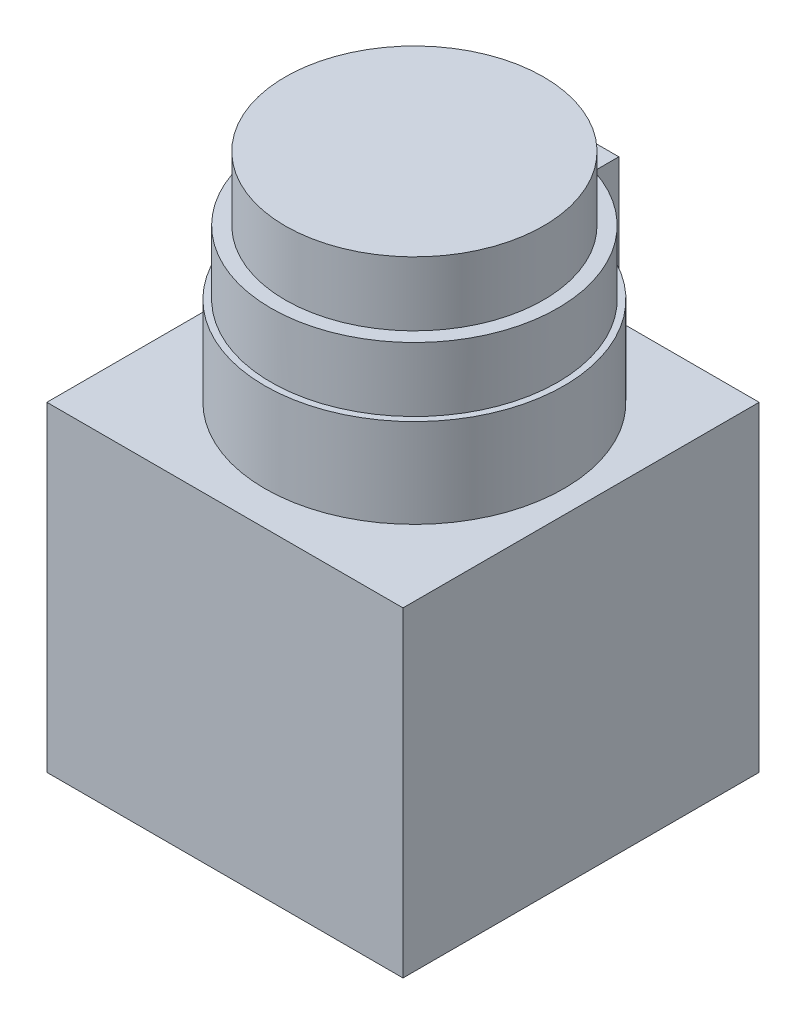
ISO-10303-21;
HEADER;
FILE_DESCRIPTION(('STEP AP214'),'2;1');
FILE_NAME('part.step','',(''),(''),'','','');
FILE_SCHEMA(('AUTOMOTIVE_DESIGN { 1 0 10303 214 1 1 1 1 }'));
ENDSEC;
DATA;
#1=APPLICATION_CONTEXT('core data for automotive mechanical design processes');
#2=APPLICATION_PROTOCOL_DEFINITION('international standard','automotive_design',2000,#1);
#3=PRODUCT_CONTEXT('',#1,'mechanical');
#4=PRODUCT('Part','Part','',(#3));
#5=PRODUCT_RELATED_PRODUCT_CATEGORY('part','',(#4));
#6=PRODUCT_DEFINITION_FORMATION('','',#4);
#7=PRODUCT_DEFINITION_CONTEXT('part definition',#1,'design');
#8=PRODUCT_DEFINITION('design','',#6,#7);
#9=PRODUCT_DEFINITION_SHAPE('','',#8);
#10=(LENGTH_UNIT() NAMED_UNIT(*) SI_UNIT(.MILLI.,.METRE.));
#11=(NAMED_UNIT(*) PLANE_ANGLE_UNIT() SI_UNIT($,.RADIAN.));
#12=(NAMED_UNIT(*) SI_UNIT($,.STERADIAN.) SOLID_ANGLE_UNIT());
#13=UNCERTAINTY_MEASURE_WITH_UNIT(LENGTH_MEASURE(1.E-05),#10,'distance_accuracy_value','');
#14=(GEOMETRIC_REPRESENTATION_CONTEXT(3) GLOBAL_UNCERTAINTY_ASSIGNED_CONTEXT((#13)) GLOBAL_UNIT_ASSIGNED_CONTEXT((#10,
#11,#12)) REPRESENTATION_CONTEXT('',''));
#15=CARTESIAN_POINT('',(0.,0.,0.));
#16=DIRECTION('',(0.,0.,1.));
#17=DIRECTION('',(1.,0.,0.));
#18=AXIS2_PLACEMENT_3D('',#15,#16,#17);
#19=CARTESIAN_POINT('',(0.,45.,0.));
#20=DIRECTION('',(0.,1.,0.));
#21=DIRECTION('',(0.,0.,1.));
#22=AXIS2_PLACEMENT_3D('',#19,#20,#21);
#23=PLANE('',#22);
#24=CARTESIAN_POINT('',(0.,45.,0.));
#25=DIRECTION('',(0.,1.,0.));
#26=DIRECTION('',(0.,0.,1.));
#27=AXIS2_PLACEMENT_3D('',#24,#25,#26);
#28=CIRCLE('',#27,21.);
#29=CARTESIAN_POINT('',(-4.5,45.,-20.512191496766));
#30=VERTEX_POINT('',#29);
#31=CARTESIAN_POINT('',(4.5,45.,-20.512191496766));
#32=VERTEX_POINT('',#31);
#33=EDGE_CURVE('E237',#30,#32,#28,.T.);
#34=ORIENTED_EDGE('',*,*,#33,.F.);
#35=DIRECTION('',(0.,0.,1.));
#36=VECTOR('',#35,1.);
#37=CARTESIAN_POINT('',(-4.5,45.,-24.2));
#38=LINE('',#37,#36);
#39=CARTESIAN_POINT('',(-4.5,45.,-24.2));
#40=VERTEX_POINT('',#39);
#41=EDGE_CURVE('E201',#40,#30,#38,.T.);
#42=ORIENTED_EDGE('',*,*,#41,.F.);
#43=DIRECTION('',(-1.,0.,0.));
#44=VECTOR('',#43,1.);
#45=CARTESIAN_POINT('',(24.2,45.,-24.2));
#46=LINE('',#45,#44);
#47=CARTESIAN_POINT('',(-25.8,45.,-24.2));
#48=VERTEX_POINT('',#47);
#49=EDGE_CURVE('E249',#40,#48,#46,.T.);
#50=ORIENTED_EDGE('',*,*,#49,.T.);
#51=DIRECTION('',(0.,0.,1.));
#52=VECTOR('',#51,1.);
#53=CARTESIAN_POINT('',(-25.8,45.,-24.2));
#54=LINE('',#53,#52);
#55=CARTESIAN_POINT('',(-25.8,45.,25.8));
#56=VERTEX_POINT('',#55);
#57=EDGE_CURVE('E254',#48,#56,#54,.T.);
#58=ORIENTED_EDGE('',*,*,#57,.T.);
#59=DIRECTION('',(1.,0.,0.));
#60=VECTOR('',#59,1.);
#61=CARTESIAN_POINT('',(-25.8,45.,25.8));
#62=LINE('',#61,#60);
#63=CARTESIAN_POINT('',(24.2,45.,25.8));
#64=VERTEX_POINT('',#63);
#65=EDGE_CURVE('E256',#56,#64,#62,.T.);
#66=ORIENTED_EDGE('',*,*,#65,.T.);
#67=DIRECTION('',(0.,0.,-1.));
#68=VECTOR('',#67,1.);
#69=CARTESIAN_POINT('',(24.2,45.,25.8));
#70=LINE('',#69,#68);
#71=CARTESIAN_POINT('',(24.2,45.,-24.2));
#72=VERTEX_POINT('',#71);
#73=EDGE_CURVE('E246',#64,#72,#70,.T.);
#74=ORIENTED_EDGE('',*,*,#73,.T.);
#75=CARTESIAN_POINT('',(4.5,45.,-24.2));
#76=VERTEX_POINT('',#75);
#77=EDGE_CURVE('E251',#72,#76,#46,.T.);
#78=ORIENTED_EDGE('',*,*,#77,.T.);
#79=DIRECTION('',(0.,0.,-1.));
#80=VECTOR('',#79,1.);
#81=CARTESIAN_POINT('',(4.5,45.,-14.));
#82=LINE('',#81,#80);
#83=EDGE_CURVE('E206',#32,#76,#82,.T.);
#84=ORIENTED_EDGE('',*,*,#83,.F.);
#85=EDGE_LOOP('',(#34,#42,#50,#58,#66,#74,#78,#84));
#86=FACE_BOUND('',#85,.T.);
#87=ADVANCED_FACE('F36',(#86),#23,.T.);
#88=CARTESIAN_POINT('',(0.,57.5,0.));
#89=DIRECTION('',(0.,-1.,0.));
#90=DIRECTION('',(0.,0.,-1.));
#91=AXIS2_PLACEMENT_3D('',#88,#89,#90);
#92=CYLINDRICAL_SURFACE('',#91,21.);
#93=DIRECTION('',(0.,-1.,0.));
#94=VECTOR('',#93,1.);
#95=CARTESIAN_POINT('',(-4.5,57.5,-20.512191496766));
#96=LINE('',#95,#94);
#97=CARTESIAN_POINT('',(-4.5,57.5,-20.512191496766));
#98=VERTEX_POINT('',#97);
#99=EDGE_CURVE('E225',#30,#98,#96,.F.);
#100=ORIENTED_EDGE('',*,*,#99,.F.);
#101=ORIENTED_EDGE('',*,*,#33,.T.);
#102=DIRECTION('',(0.,-1.,0.));
#103=VECTOR('',#102,1.);
#104=CARTESIAN_POINT('',(4.5,57.5,-20.512191496766));
#105=LINE('',#104,#103);
#106=CARTESIAN_POINT('',(4.5,57.5,-20.512191496766));
#107=VERTEX_POINT('',#106);
#108=EDGE_CURVE('E220',#107,#32,#105,.T.);
#109=ORIENTED_EDGE('',*,*,#108,.F.);
#110=CARTESIAN_POINT('',(0.,57.5,0.));
#111=DIRECTION('',(0.,1.,0.));
#112=DIRECTION('',(0.,0.,1.));
#113=AXIS2_PLACEMENT_3D('',#110,#111,#112);
#114=CIRCLE('',#113,21.);
#115=EDGE_CURVE('E240',#98,#107,#114,.T.);
#116=ORIENTED_EDGE('',*,*,#115,.F.);
#117=EDGE_LOOP('',(#100,#101,#109,#116));
#118=FACE_BOUND('',#117,.T.);
#119=ADVANCED_FACE('F316',(#118),#92,.T.);
#120=CARTESIAN_POINT('',(0.,57.5,0.));
#121=DIRECTION('',(0.,1.,0.));
#122=DIRECTION('',(0.,0.,1.));
#123=AXIS2_PLACEMENT_3D('',#120,#121,#122);
#124=PLANE('',#123);
#125=CARTESIAN_POINT('',(0.,57.5,0.));
#126=DIRECTION('',(0.,1.,0.));
#127=DIRECTION('',(0.,0.,1.));
#128=AXIS2_PLACEMENT_3D('',#125,#126,#127);
#129=CIRCLE('',#128,20.1324888100541);
#130=CARTESIAN_POINT('',(-4.5,57.5,-19.6231268070854));
#131=VERTEX_POINT('',#130);
#132=CARTESIAN_POINT('',(4.5,57.5,-19.6231268070854));
#133=VERTEX_POINT('',#132);
#134=EDGE_CURVE('E231',#131,#133,#129,.T.);
#135=ORIENTED_EDGE('',*,*,#134,.F.);
#136=DIRECTION('',(0.,0.,-1.));
#137=VECTOR('',#136,1.);
#138=CARTESIAN_POINT('',(-4.5,57.5,0.));
#139=LINE('',#138,#137);
#140=EDGE_CURVE('E222',#131,#98,#139,.T.);
#141=ORIENTED_EDGE('',*,*,#140,.T.);
#142=ORIENTED_EDGE('',*,*,#115,.T.);
#143=DIRECTION('',(0.,0.,1.));
#144=VECTOR('',#143,1.);
#145=CARTESIAN_POINT('',(4.5,57.5,0.));
#146=LINE('',#145,#144);
#147=EDGE_CURVE('E217',#107,#133,#146,.T.);
#148=ORIENTED_EDGE('',*,*,#147,.T.);
#149=EDGE_LOOP('',(#135,#141,#142,#148));
#150=FACE_BOUND('',#149,.T.);
#151=ADVANCED_FACE('F322',(#150),#124,.T.);
#152=CARTESIAN_POINT('',(0.,66.5,0.));
#153=DIRECTION('',(0.,-1.,0.));
#154=DIRECTION('',(0.,0.,-1.));
#155=AXIS2_PLACEMENT_3D('',#152,#153,#154);
#156=CYLINDRICAL_SURFACE('',#155,20.1324888100541);
#157=CARTESIAN_POINT('',(0.,66.5,0.));
#158=DIRECTION('',(0.,1.,0.));
#159=DIRECTION('',(0.,0.,1.));
#160=AXIS2_PLACEMENT_3D('',#157,#158,#159);
#161=CIRCLE('',#160,20.1324888100541);
#162=CARTESIAN_POINT('',(0.,66.5,20.1324888100541));
#163=VERTEX_POINT('',#162);
#164=EDGE_CURVE('E234',#163,#163,#161,.T.);
#165=ORIENTED_EDGE('',*,*,#164,.F.);
#166=EDGE_LOOP('',(#165));
#167=FACE_BOUND('',#166,.T.);
#168=DIRECTION('',(0.,-1.,0.));
#169=VECTOR('',#168,1.);
#170=CARTESIAN_POINT('',(-4.5,66.5,-19.6231268070854));
#171=LINE('',#170,#169);
#172=CARTESIAN_POINT('',(-4.5,65.,-19.6231268070854));
#173=VERTEX_POINT('',#172);
#174=EDGE_CURVE('E282',#131,#173,#171,.F.);
#175=ORIENTED_EDGE('',*,*,#174,.F.);
#176=ORIENTED_EDGE('',*,*,#134,.T.);
#177=DIRECTION('',(0.,-1.,0.));
#178=VECTOR('',#177,1.);
#179=CARTESIAN_POINT('',(4.5,66.5,-19.6231268070854));
#180=LINE('',#179,#178);
#181=CARTESIAN_POINT('',(4.5,65.,-19.6231268070854));
#182=VERTEX_POINT('',#181);
#183=EDGE_CURVE('E280',#182,#133,#180,.T.);
#184=ORIENTED_EDGE('',*,*,#183,.F.);
#185=CARTESIAN_POINT('',(0.,65.,0.));
#186=DIRECTION('',(0.,1.,0.));
#187=DIRECTION('',(0.,0.,1.));
#188=AXIS2_PLACEMENT_3D('',#185,#186,#187);
#189=CIRCLE('',#188,20.1324888100541);
#190=EDGE_CURVE('E277',#182,#173,#189,.T.);
#191=ORIENTED_EDGE('',*,*,#190,.T.);
#192=EDGE_LOOP('',(#175,#176,#184,#191));
#193=FACE_BOUND('',#192,.T.);
#194=ADVANCED_FACE('F345',(#167,#193),#156,.T.);
#195=CARTESIAN_POINT('',(24.2,45.,25.8));
#196=DIRECTION('',(-1.,0.,0.));
#197=DIRECTION('',(0.,0.,1.));
#198=AXIS2_PLACEMENT_3D('',#195,#196,#197);
#199=PLANE('',#198);
#200=DIRECTION('',(0.,0.,-1.));
#201=VECTOR('',#200,1.);
#202=CARTESIAN_POINT('',(24.2,0.,25.8));
#203=LINE('',#202,#201);
#204=CARTESIAN_POINT('',(24.2,0.,25.8));
#205=VERTEX_POINT('',#204);
#206=CARTESIAN_POINT('',(24.2,0.,-24.2));
#207=VERTEX_POINT('',#206);
#208=EDGE_CURVE('E243',#205,#207,#203,.T.);
#209=ORIENTED_EDGE('',*,*,#208,.T.);
#210=DIRECTION('',(0.,-1.,0.));
#211=VECTOR('',#210,1.);
#212=CARTESIAN_POINT('',(24.2,45.,-24.2));
#213=LINE('',#212,#211);
#214=EDGE_CURVE('E274',#72,#207,#213,.T.);
#215=ORIENTED_EDGE('',*,*,#214,.F.);
#216=ORIENTED_EDGE('',*,*,#73,.F.);
#217=DIRECTION('',(0.,-1.,0.));
#218=VECTOR('',#217,1.);
#219=CARTESIAN_POINT('',(24.2,45.,25.8));
#220=LINE('',#219,#218);
#221=EDGE_CURVE('E258',#64,#205,#220,.T.);
#222=ORIENTED_EDGE('',*,*,#221,.T.);
#223=EDGE_LOOP('',(#209,#215,#216,#222));
#224=FACE_BOUND('',#223,.T.);
#225=ADVANCED_FACE('F342',(#224),#199,.F.);
#226=CARTESIAN_POINT('',(24.2,45.,-24.2));
#227=DIRECTION('',(0.,0.,1.));
#228=DIRECTION('',(1.,0.,0.));
#229=AXIS2_PLACEMENT_3D('',#226,#227,#228);
#230=PLANE('',#229);
#231=DIRECTION('',(-1.,0.,0.));
#232=VECTOR('',#231,1.);
#233=CARTESIAN_POINT('',(24.2,0.,-24.2));
#234=LINE('',#233,#232);
#235=CARTESIAN_POINT('',(-25.8,0.,-24.2));
#236=VERTEX_POINT('',#235);
#237=EDGE_CURVE('E261',#207,#236,#234,.T.);
#238=ORIENTED_EDGE('',*,*,#237,.T.);
#239=DIRECTION('',(0.,-1.,0.));
#240=VECTOR('',#239,1.);
#241=CARTESIAN_POINT('',(-25.8,45.,-24.2));
#242=LINE('',#241,#240);
#243=EDGE_CURVE('E271',#48,#236,#242,.T.);
#244=ORIENTED_EDGE('',*,*,#243,.F.);
#245=ORIENTED_EDGE('',*,*,#49,.F.);
#246=DIRECTION('',(0.,-1.,0.));
#247=VECTOR('',#246,1.);
#248=CARTESIAN_POINT('',(-4.5,65.,-24.2));
#249=LINE('',#248,#247);
#250=CARTESIAN_POINT('',(-4.5,65.,-24.2));
#251=VERTEX_POINT('',#250);
#252=EDGE_CURVE('E215',#251,#40,#249,.T.);
#253=ORIENTED_EDGE('',*,*,#252,.F.);
#254=DIRECTION('',(-1.,0.,0.));
#255=VECTOR('',#254,1.);
#256=CARTESIAN_POINT('',(4.5,65.,-24.2));
#257=LINE('',#256,#255);
#258=CARTESIAN_POINT('',(4.5,65.,-24.2));
#259=VERTEX_POINT('',#258);
#260=EDGE_CURVE('E202',#259,#251,#257,.T.);
#261=ORIENTED_EDGE('',*,*,#260,.F.);
#262=DIRECTION('',(0.,-1.,0.));
#263=VECTOR('',#262,1.);
#264=CARTESIAN_POINT('',(4.5,65.,-24.2));
#265=LINE('',#264,#263);
#266=EDGE_CURVE('E210',#259,#76,#265,.T.);
#267=ORIENTED_EDGE('',*,*,#266,.T.);
#268=ORIENTED_EDGE('',*,*,#77,.F.);
#269=ORIENTED_EDGE('',*,*,#214,.T.);
#270=EDGE_LOOP('',(#238,#244,#245,#253,#261,#267,#268,#269));
#271=FACE_BOUND('',#270,.T.);
#272=ADVANCED_FACE('F339',(#271),#230,.F.);
#273=CARTESIAN_POINT('',(-25.8,45.,-24.2));
#274=DIRECTION('',(1.,0.,0.));
#275=DIRECTION('',(0.,0.,-1.));
#276=AXIS2_PLACEMENT_3D('',#273,#274,#275);
#277=PLANE('',#276);
#278=DIRECTION('',(0.,0.,1.));
#279=VECTOR('',#278,1.);
#280=CARTESIAN_POINT('',(-25.8,3.,19.8));
#281=LINE('',#280,#279);
#282=CARTESIAN_POINT('',(-25.8,3.,13.8));
#283=VERTEX_POINT('',#282);
#284=CARTESIAN_POINT('',(-25.8,3.,19.8));
#285=VERTEX_POINT('',#284);
#286=EDGE_CURVE('E181',#283,#285,#281,.T.);
#287=ORIENTED_EDGE('',*,*,#286,.F.);
#288=DIRECTION('',(0.,-1.,0.));
#289=VECTOR('',#288,1.);
#290=CARTESIAN_POINT('',(-25.8,3.,13.8));
#291=LINE('',#290,#289);
#292=CARTESIAN_POINT('',(-25.8,4.,13.8));
#293=VERTEX_POINT('',#292);
#294=EDGE_CURVE('E166',#293,#283,#291,.T.);
#295=ORIENTED_EDGE('',*,*,#294,.F.);
#296=CARTESIAN_POINT('',(-25.8,4.,15.8));
#297=DIRECTION('',(1.,0.,0.));
#298=DIRECTION('',(0.,0.,-1.));
#299=AXIS2_PLACEMENT_3D('',#296,#297,#298);
#300=CIRCLE('',#299,2.);
#301=CARTESIAN_POINT('',(-25.8,6.,15.8));
#302=VERTEX_POINT('',#301);
#303=EDGE_CURVE('E11',#293,#302,#300,.T.);
#304=ORIENTED_EDGE('',*,*,#303,.T.);
#305=DIRECTION('',(0.,0.,-1.));
#306=VECTOR('',#305,1.);
#307=CARTESIAN_POINT('',(-25.8,6.,13.8));
#308=LINE('',#307,#306);
#309=CARTESIAN_POINT('',(-25.8,6.,17.8));
#310=VERTEX_POINT('',#309);
#311=EDGE_CURVE('E160',#310,#302,#308,.T.);
#312=ORIENTED_EDGE('',*,*,#311,.F.);
#313=CARTESIAN_POINT('',(-25.8,4.,17.8));
#314=DIRECTION('',(1.,0.,0.));
#315=DIRECTION('',(0.,0.,-1.));
#316=AXIS2_PLACEMENT_3D('',#313,#314,#315);
#317=CIRCLE('',#316,2.);
#318=CARTESIAN_POINT('',(-25.8,4.,19.8));
#319=VERTEX_POINT('',#318);
#320=EDGE_CURVE('E44',#310,#319,#317,.T.);
#321=ORIENTED_EDGE('',*,*,#320,.T.);
#322=DIRECTION('',(0.,1.,0.));
#323=VECTOR('',#322,1.);
#324=CARTESIAN_POINT('',(-25.8,6.,19.8));
#325=LINE('',#324,#323);
#326=EDGE_CURVE('E183',#285,#319,#325,.T.);
#327=ORIENTED_EDGE('',*,*,#326,.F.);
#328=EDGE_LOOP('',(#287,#295,#304,#312,#321,#327));
#329=FACE_BOUND('',#328,.T.);
#330=DIRECTION('',(0.,0.,1.));
#331=VECTOR('',#330,1.);
#332=CARTESIAN_POINT('',(-25.8,0.,-24.2));
#333=LINE('',#332,#331);
#334=CARTESIAN_POINT('',(-25.8,0.,25.8));
#335=VERTEX_POINT('',#334);
#336=EDGE_CURVE('E263',#236,#335,#333,.T.);
#337=ORIENTED_EDGE('',*,*,#336,.T.);
#338=DIRECTION('',(0.,-1.,0.));
#339=VECTOR('',#338,1.);
#340=CARTESIAN_POINT('',(-25.8,45.,25.8));
#341=LINE('',#340,#339);
#342=EDGE_CURVE('E268',#56,#335,#341,.T.);
#343=ORIENTED_EDGE('',*,*,#342,.F.);
#344=ORIENTED_EDGE('',*,*,#57,.F.);
#345=ORIENTED_EDGE('',*,*,#243,.T.);
#346=EDGE_LOOP('',(#337,#343,#344,#345));
#347=FACE_BOUND('',#346,.T.);
#348=ADVANCED_FACE('F299',(#329,#347),#277,.F.);
#349=CARTESIAN_POINT('',(-25.8,45.,25.8));
#350=DIRECTION('',(0.,0.,-1.));
#351=DIRECTION('',(-1.,0.,0.));
#352=AXIS2_PLACEMENT_3D('',#349,#350,#351);
#353=PLANE('',#352);
#354=DIRECTION('',(1.,0.,0.));
#355=VECTOR('',#354,1.);
#356=CARTESIAN_POINT('',(-25.8,0.,25.8));
#357=LINE('',#356,#355);
#358=EDGE_CURVE('E250',#335,#205,#357,.T.);
#359=ORIENTED_EDGE('',*,*,#358,.T.);
#360=ORIENTED_EDGE('',*,*,#221,.F.);
#361=ORIENTED_EDGE('',*,*,#65,.F.);
#362=ORIENTED_EDGE('',*,*,#342,.T.);
#363=EDGE_LOOP('',(#359,#360,#361,#362));
#364=FACE_BOUND('',#363,.T.);
#365=ADVANCED_FACE('F332',(#364),#353,.F.);
#366=CARTESIAN_POINT('',(0.,0.,0.));
#367=DIRECTION('',(0.,1.,0.));
#368=DIRECTION('',(0.,0.,1.));
#369=AXIS2_PLACEMENT_3D('',#366,#367,#368);
#370=PLANE('',#369);
#371=CARTESIAN_POINT('',(18.4200888582828,0.,20.8));
#372=DIRECTION('',(0.,-1.,0.));
#373=DIRECTION('',(0.,0.,-1.));
#374=AXIS2_PLACEMENT_3D('',#371,#372,#373);
#375=CIRCLE('',#374,1.25);
#376=CARTESIAN_POINT('',(18.4200888582828,0.,19.55));
#377=VERTEX_POINT('',#376);
#378=EDGE_CURVE('E188',#377,#377,#375,.T.);
#379=ORIENTED_EDGE('',*,*,#378,.F.);
#380=EDGE_LOOP('',(#379));
#381=FACE_BOUND('',#380,.T.);
#382=CARTESIAN_POINT('',(-21.5799111417172,0.,-19.2));
#383=DIRECTION('',(0.,-1.,0.));
#384=DIRECTION('',(0.,0.,-1.));
#385=AXIS2_PLACEMENT_3D('',#382,#383,#384);
#386=CIRCLE('',#385,1.25);
#387=CARTESIAN_POINT('',(-21.5799111417172,0.,-20.45));
#388=VERTEX_POINT('',#387);
#389=EDGE_CURVE('E195',#388,#388,#386,.T.);
#390=ORIENTED_EDGE('',*,*,#389,.F.);
#391=EDGE_LOOP('',(#390));
#392=FACE_BOUND('',#391,.T.);
#393=ORIENTED_EDGE('',*,*,#208,.F.);
#394=ORIENTED_EDGE('',*,*,#358,.F.);
#395=ORIENTED_EDGE('',*,*,#336,.F.);
#396=ORIENTED_EDGE('',*,*,#237,.F.);
#397=EDGE_LOOP('',(#393,#394,#395,#396));
#398=FACE_BOUND('',#397,.T.);
#399=ADVANCED_FACE('F328',(#381,#392,#398),#370,.F.);
#400=CARTESIAN_POINT('',(0.,66.5,0.));
#401=DIRECTION('',(0.,1.,0.));
#402=DIRECTION('',(0.,0.,1.));
#403=AXIS2_PLACEMENT_3D('',#400,#401,#402);
#404=PLANE('',#403);
#405=CARTESIAN_POINT('',(0.,66.5,0.));
#406=DIRECTION('',(0.,1.,0.));
#407=DIRECTION('',(0.,0.,1.));
#408=AXIS2_PLACEMENT_3D('',#405,#406,#407);
#409=CIRCLE('',#408,18.1324888100541);
#410=CARTESIAN_POINT('',(0.,66.5,18.1324888100541));
#411=VERTEX_POINT('',#410);
#412=EDGE_CURVE('E227',#411,#411,#409,.T.);
#413=ORIENTED_EDGE('',*,*,#412,.F.);
#414=EDGE_LOOP('',(#413));
#415=FACE_BOUND('',#414,.T.);
#416=ORIENTED_EDGE('',*,*,#164,.T.);
#417=EDGE_LOOP('',(#416));
#418=FACE_BOUND('',#417,.T.);
#419=ADVANCED_FACE('F331',(#415,#418),#404,.T.);
#420=CARTESIAN_POINT('',(0.,75.5,0.));
#421=DIRECTION('',(0.,-1.,0.));
#422=DIRECTION('',(0.,0.,-1.));
#423=AXIS2_PLACEMENT_3D('',#420,#421,#422);
#424=CYLINDRICAL_SURFACE('',#423,18.1324888100541);
#425=CARTESIAN_POINT('',(0.,75.5,0.));
#426=DIRECTION('',(0.,1.,0.));
#427=DIRECTION('',(0.,0.,1.));
#428=AXIS2_PLACEMENT_3D('',#425,#426,#427);
#429=CIRCLE('',#428,18.1324888100541);
#430=CARTESIAN_POINT('',(0.,75.5,18.1324888100541));
#431=VERTEX_POINT('',#430);
#432=EDGE_CURVE('E228',#431,#431,#429,.T.);
#433=ORIENTED_EDGE('',*,*,#432,.F.);
#434=EDGE_LOOP('',(#433));
#435=FACE_BOUND('',#434,.T.);
#436=ORIENTED_EDGE('',*,*,#412,.T.);
#437=EDGE_LOOP('',(#436));
#438=FACE_BOUND('',#437,.T.);
#439=ADVANCED_FACE('F398',(#435,#438),#424,.T.);
#440=CARTESIAN_POINT('',(0.,75.5,0.));
#441=DIRECTION('',(0.,1.,0.));
#442=DIRECTION('',(0.,0.,1.));
#443=AXIS2_PLACEMENT_3D('',#440,#441,#442);
#444=PLANE('',#443);
#445=ORIENTED_EDGE('',*,*,#432,.T.);
#446=EDGE_LOOP('',(#445));
#447=FACE_BOUND('',#446,.T.);
#448=ADVANCED_FACE('F392',(#447),#444,.T.);
#449=CARTESIAN_POINT('',(-4.5,65.,-24.2));
#450=DIRECTION('',(1.,0.,0.));
#451=DIRECTION('',(0.,0.,-1.));
#452=AXIS2_PLACEMENT_3D('',#449,#450,#451);
#453=PLANE('',#452);
#454=ORIENTED_EDGE('',*,*,#41,.T.);
#455=ORIENTED_EDGE('',*,*,#99,.T.);
#456=ORIENTED_EDGE('',*,*,#140,.F.);
#457=ORIENTED_EDGE('',*,*,#174,.T.);
#458=DIRECTION('',(0.,0.,1.));
#459=VECTOR('',#458,1.);
#460=CARTESIAN_POINT('',(-4.5,65.,-24.2));
#461=LINE('',#460,#459);
#462=EDGE_CURVE('E205',#251,#173,#461,.T.);
#463=ORIENTED_EDGE('',*,*,#462,.F.);
#464=ORIENTED_EDGE('',*,*,#252,.T.);
#465=EDGE_LOOP('',(#454,#455,#456,#457,#463,#464));
#466=FACE_BOUND('',#465,.T.);
#467=ADVANCED_FACE('F371',(#466),#453,.F.);
#468=CARTESIAN_POINT('',(4.5,65.,-14.));
#469=DIRECTION('',(-1.,0.,0.));
#470=DIRECTION('',(0.,0.,1.));
#471=AXIS2_PLACEMENT_3D('',#468,#469,#470);
#472=PLANE('',#471);
#473=ORIENTED_EDGE('',*,*,#147,.F.);
#474=ORIENTED_EDGE('',*,*,#108,.T.);
#475=ORIENTED_EDGE('',*,*,#83,.T.);
#476=ORIENTED_EDGE('',*,*,#266,.F.);
#477=DIRECTION('',(0.,0.,-1.));
#478=VECTOR('',#477,1.);
#479=CARTESIAN_POINT('',(4.5,65.,-14.));
#480=LINE('',#479,#478);
#481=EDGE_CURVE('E208',#182,#259,#480,.T.);
#482=ORIENTED_EDGE('',*,*,#481,.F.);
#483=ORIENTED_EDGE('',*,*,#183,.T.);
#484=EDGE_LOOP('',(#473,#474,#475,#476,#482,#483));
#485=FACE_BOUND('',#484,.T.);
#486=ADVANCED_FACE('F383',(#485),#472,.F.);
#487=CARTESIAN_POINT('',(0.,65.,0.));
#488=DIRECTION('',(0.,1.,0.));
#489=DIRECTION('',(0.,0.,1.));
#490=AXIS2_PLACEMENT_3D('',#487,#488,#489);
#491=PLANE('',#490);
#492=ORIENTED_EDGE('',*,*,#190,.F.);
#493=ORIENTED_EDGE('',*,*,#481,.T.);
#494=ORIENTED_EDGE('',*,*,#260,.T.);
#495=ORIENTED_EDGE('',*,*,#462,.T.);
#496=EDGE_LOOP('',(#492,#493,#494,#495));
#497=FACE_BOUND('',#496,.T.);
#498=ADVANCED_FACE('F381',(#497),#491,.T.);
#499=CARTESIAN_POINT('',(-21.5799111417172,8.00000000000001,-19.2));
#500=DIRECTION('',(0.,-1.,0.));
#501=DIRECTION('',(0.,0.,-1.));
#502=AXIS2_PLACEMENT_3D('',#499,#500,#501);
#503=CONICAL_SURFACE('',#502,1.25,1.02974425867666);
#504=CARTESIAN_POINT('',(-21.5799111417172,8.75107577378445,-19.2));
#505=VERTEX_POINT('',#504);
#506=VERTEX_LOOP('',#505);
#507=FACE_BOUND('',#506,.T.);
#508=CARTESIAN_POINT('',(-21.5799111417172,8.00000000000001,-19.2));
#509=DIRECTION('',(0.,-1.,0.));
#510=DIRECTION('',(0.,0.,-1.));
#511=AXIS2_PLACEMENT_3D('',#508,#509,#510);
#512=CIRCLE('',#511,1.25);
#513=CARTESIAN_POINT('',(-21.5799111417172,8.00000000000001,-20.45));
#514=VERTEX_POINT('',#513);
#515=EDGE_CURVE('E198',#514,#514,#512,.T.);
#516=ORIENTED_EDGE('',*,*,#515,.T.);
#517=EDGE_LOOP('',(#516));
#518=FACE_BOUND('',#517,.T.);
#519=ADVANCED_FACE('F390',(#507,#518),#503,.F.);
#520=CARTESIAN_POINT('',(-21.5799111417172,0.,-19.2));
#521=DIRECTION('',(0.,-1.,0.));
#522=DIRECTION('',(0.,0.,-1.));
#523=AXIS2_PLACEMENT_3D('',#520,#521,#522);
#524=CYLINDRICAL_SURFACE('',#523,1.25);
#525=ORIENTED_EDGE('',*,*,#515,.F.);
#526=EDGE_LOOP('',(#525));
#527=FACE_BOUND('',#526,.T.);
#528=ORIENTED_EDGE('',*,*,#389,.T.);
#529=EDGE_LOOP('',(#528));
#530=FACE_BOUND('',#529,.T.);
#531=ADVANCED_FACE('F456',(#527,#530),#524,.F.);
#532=CARTESIAN_POINT('',(18.4200888582828,8.00000000000001,20.8));
#533=DIRECTION('',(0.,-1.,0.));
#534=DIRECTION('',(0.,0.,-1.));
#535=AXIS2_PLACEMENT_3D('',#532,#533,#534);
#536=CONICAL_SURFACE('',#535,1.25,1.02974425867666);
#537=CARTESIAN_POINT('',(18.4200888582828,8.75107577378445,20.8));
#538=VERTEX_POINT('',#537);
#539=VERTEX_LOOP('',#538);
#540=FACE_BOUND('',#539,.T.);
#541=CARTESIAN_POINT('',(18.4200888582828,8.00000000000001,20.8));
#542=DIRECTION('',(0.,-1.,0.));
#543=DIRECTION('',(0.,0.,-1.));
#544=AXIS2_PLACEMENT_3D('',#541,#542,#543);
#545=CIRCLE('',#544,1.25);
#546=CARTESIAN_POINT('',(18.4200888582828,8.00000000000001,19.55));
#547=VERTEX_POINT('',#546);
#548=EDGE_CURVE('E192',#547,#547,#545,.T.);
#549=ORIENTED_EDGE('',*,*,#548,.T.);
#550=EDGE_LOOP('',(#549));
#551=FACE_BOUND('',#550,.T.);
#552=ADVANCED_FACE('F465',(#540,#551),#536,.F.);
#553=CARTESIAN_POINT('',(18.4200888582828,0.,20.8));
#554=DIRECTION('',(0.,-1.,0.));
#555=DIRECTION('',(0.,0.,-1.));
#556=AXIS2_PLACEMENT_3D('',#553,#554,#555);
#557=CYLINDRICAL_SURFACE('',#556,1.25);
#558=ORIENTED_EDGE('',*,*,#548,.F.);
#559=EDGE_LOOP('',(#558));
#560=FACE_BOUND('',#559,.T.);
#561=ORIENTED_EDGE('',*,*,#378,.T.);
#562=EDGE_LOOP('',(#561));
#563=FACE_BOUND('',#562,.T.);
#564=ADVANCED_FACE('F475',(#560,#563),#557,.F.);
#565=CARTESIAN_POINT('',(-20.8,3.,13.8));
#566=DIRECTION('',(0.,0.,-1.));
#567=DIRECTION('',(-1.,0.,0.));
#568=AXIS2_PLACEMENT_3D('',#565,#566,#567);
#569=PLANE('',#568);
#570=DIRECTION('',(0.,-1.,0.));
#571=VECTOR('',#570,1.);
#572=CARTESIAN_POINT('',(-20.8,3.,13.8));
#573=LINE('',#572,#571);
#574=CARTESIAN_POINT('',(-20.8,4.,13.8));
#575=VERTEX_POINT('',#574);
#576=CARTESIAN_POINT('',(-20.8,3.,13.8));
#577=VERTEX_POINT('',#576);
#578=EDGE_CURVE('E153',#575,#577,#573,.T.);
#579=ORIENTED_EDGE('',*,*,#578,.F.);
#580=DIRECTION('',(-1.,0.,0.));
#581=VECTOR('',#580,1.);
#582=CARTESIAN_POINT('',(-25.8,4.,13.8));
#583=LINE('',#582,#581);
#584=EDGE_CURVE('E295',#575,#293,#583,.T.);
#585=ORIENTED_EDGE('',*,*,#584,.T.);
#586=ORIENTED_EDGE('',*,*,#294,.T.);
#587=DIRECTION('',(-1.,0.,0.));
#588=VECTOR('',#587,1.);
#589=CARTESIAN_POINT('',(-20.8,3.,13.8));
#590=LINE('',#589,#588);
#591=EDGE_CURVE('E163',#577,#283,#590,.T.);
#592=ORIENTED_EDGE('',*,*,#591,.F.);
#593=EDGE_LOOP('',(#579,#585,#586,#592));
#594=FACE_BOUND('',#593,.T.);
#595=ADVANCED_FACE('F164',(#594),#569,.F.);
#596=CARTESIAN_POINT('',(-20.8,6.,13.8));
#597=DIRECTION('',(0.,1.,0.));
#598=DIRECTION('',(0.,0.,1.));
#599=AXIS2_PLACEMENT_3D('',#596,#597,#598);
#600=PLANE('',#599);
#601=DIRECTION('',(0.,0.,-1.));
#602=VECTOR('',#601,1.);
#603=CARTESIAN_POINT('',(-20.8,6.,13.8));
#604=LINE('',#603,#602);
#605=CARTESIAN_POINT('',(-20.8,6.,17.8));
#606=VERTEX_POINT('',#605);
#607=CARTESIAN_POINT('',(-20.8,6.,15.8));
#608=VERTEX_POINT('',#607);
#609=EDGE_CURVE('E171',#606,#608,#604,.T.);
#610=ORIENTED_EDGE('',*,*,#609,.F.);
#611=DIRECTION('',(-1.,0.,0.));
#612=VECTOR('',#611,1.);
#613=CARTESIAN_POINT('',(-25.8,6.,17.8));
#614=LINE('',#613,#612);
#615=EDGE_CURVE('E287',#606,#310,#614,.T.);
#616=ORIENTED_EDGE('',*,*,#615,.T.);
#617=ORIENTED_EDGE('',*,*,#311,.T.);
#618=DIRECTION('',(-1.,0.,0.));
#619=VECTOR('',#618,1.);
#620=CARTESIAN_POINT('',(-20.8,6.,15.8));
#621=LINE('',#620,#619);
#622=EDGE_CURVE('E285',#302,#608,#621,.F.);
#623=ORIENTED_EDGE('',*,*,#622,.T.);
#624=EDGE_LOOP('',(#610,#616,#617,#623));
#625=FACE_BOUND('',#624,.T.);
#626=ADVANCED_FACE('F310',(#625),#600,.F.);
#627=CARTESIAN_POINT('',(-20.8,6.,19.8));
#628=DIRECTION('',(0.,0.,1.));
#629=DIRECTION('',(1.,0.,0.));
#630=AXIS2_PLACEMENT_3D('',#627,#628,#629);
#631=PLANE('',#630);
#632=ORIENTED_EDGE('',*,*,#326,.T.);
#633=DIRECTION('',(-1.,0.,0.));
#634=VECTOR('',#633,1.);
#635=CARTESIAN_POINT('',(-20.8,4.,19.8));
#636=LINE('',#635,#634);
#637=CARTESIAN_POINT('',(-20.8,4.,19.8));
#638=VERTEX_POINT('',#637);
#639=EDGE_CURVE('E290',#319,#638,#636,.F.);
#640=ORIENTED_EDGE('',*,*,#639,.T.);
#641=DIRECTION('',(0.,1.,0.));
#642=VECTOR('',#641,1.);
#643=CARTESIAN_POINT('',(-20.8,6.,19.8));
#644=LINE('',#643,#642);
#645=CARTESIAN_POINT('',(-20.8,3.,19.8));
#646=VERTEX_POINT('',#645);
#647=EDGE_CURVE('E175',#646,#638,#644,.T.);
#648=ORIENTED_EDGE('',*,*,#647,.F.);
#649=DIRECTION('',(-1.,0.,0.));
#650=VECTOR('',#649,1.);
#651=CARTESIAN_POINT('',(-20.8,3.,19.8));
#652=LINE('',#651,#650);
#653=EDGE_CURVE('E170',#646,#285,#652,.T.);
#654=ORIENTED_EDGE('',*,*,#653,.T.);
#655=EDGE_LOOP('',(#632,#640,#648,#654));
#656=FACE_BOUND('',#655,.T.);
#657=ADVANCED_FACE('F305',(#656),#631,.F.);
#658=CARTESIAN_POINT('',(-20.8,3.,19.8));
#659=DIRECTION('',(0.,-1.,0.));
#660=DIRECTION('',(0.,0.,-1.));
#661=AXIS2_PLACEMENT_3D('',#658,#659,#660);
#662=PLANE('',#661);
#663=ORIENTED_EDGE('',*,*,#286,.T.);
#664=ORIENTED_EDGE('',*,*,#653,.F.);
#665=DIRECTION('',(0.,0.,1.));
#666=VECTOR('',#665,1.);
#667=CARTESIAN_POINT('',(-20.8,3.,19.8));
#668=LINE('',#667,#666);
#669=EDGE_CURVE('E158',#577,#646,#668,.T.);
#670=ORIENTED_EDGE('',*,*,#669,.F.);
#671=ORIENTED_EDGE('',*,*,#591,.T.);
#672=EDGE_LOOP('',(#663,#664,#670,#671));
#673=FACE_BOUND('',#672,.T.);
#674=ADVANCED_FACE('F173',(#673),#662,.F.);
#675=CARTESIAN_POINT('',(-20.8,0.,0.));
#676=DIRECTION('',(1.,0.,0.));
#677=DIRECTION('',(0.,0.,-1.));
#678=AXIS2_PLACEMENT_3D('',#675,#676,#677);
#679=PLANE('',#678);
#680=ORIENTED_EDGE('',*,*,#647,.T.);
#681=CARTESIAN_POINT('',(-20.8,4.,17.8));
#682=DIRECTION('',(1.,0.,0.));
#683=DIRECTION('',(0.,0.,-1.));
#684=AXIS2_PLACEMENT_3D('',#681,#682,#683);
#685=CIRCLE('',#684,2.);
#686=EDGE_CURVE('E293',#638,#606,#685,.F.);
#687=ORIENTED_EDGE('',*,*,#686,.T.);
#688=ORIENTED_EDGE('',*,*,#609,.T.);
#689=CARTESIAN_POINT('',(-20.8,4.,15.8));
#690=DIRECTION('',(1.,0.,0.));
#691=DIRECTION('',(0.,0.,-1.));
#692=AXIS2_PLACEMENT_3D('',#689,#690,#691);
#693=CIRCLE('',#692,2.);
#694=EDGE_CURVE('E57',#608,#575,#693,.F.);
#695=ORIENTED_EDGE('',*,*,#694,.T.);
#696=ORIENTED_EDGE('',*,*,#578,.T.);
#697=ORIENTED_EDGE('',*,*,#669,.T.);
#698=EDGE_LOOP('',(#680,#687,#688,#695,#696,#697));
#699=FACE_BOUND('',#698,.T.);
#700=ADVANCED_FACE('F156',(#699),#679,.F.);
#701=CARTESIAN_POINT('',(-20.8,4.,17.8));
#702=DIRECTION('',(1.,0.,0.));
#703=DIRECTION('',(0.,0.,-1.));
#704=AXIS2_PLACEMENT_3D('',#701,#702,#703);
#705=CYLINDRICAL_SURFACE('',#704,2.);
#706=ORIENTED_EDGE('',*,*,#686,.F.);
#707=ORIENTED_EDGE('',*,*,#639,.F.);
#708=ORIENTED_EDGE('',*,*,#320,.F.);
#709=ORIENTED_EDGE('',*,*,#615,.F.);
#710=EDGE_LOOP('',(#706,#707,#708,#709));
#711=FACE_BOUND('',#710,.T.);
#712=ADVANCED_FACE('F307',(#711),#705,.F.);
#713=CARTESIAN_POINT('',(-20.8,4.,15.8));
#714=DIRECTION('',(1.,0.,0.));
#715=DIRECTION('',(0.,0.,-1.));
#716=AXIS2_PLACEMENT_3D('',#713,#714,#715);
#717=CYLINDRICAL_SURFACE('',#716,2.);
#718=ORIENTED_EDGE('',*,*,#694,.F.);
#719=ORIENTED_EDGE('',*,*,#622,.F.);
#720=ORIENTED_EDGE('',*,*,#303,.F.);
#721=ORIENTED_EDGE('',*,*,#584,.F.);
#722=EDGE_LOOP('',(#718,#719,#720,#721));
#723=FACE_BOUND('',#722,.T.);
#724=ADVANCED_FACE('F38',(#723),#717,.F.);
#725=CLOSED_SHELL('',(#87,#119,#151,#194,#225,#272,#348,#365,#399,#419,#439,#448,#467,#486,#498,
#519,#531,#552,#564,#595,#626,#657,#674,#700,#712,#724));
#726=MANIFOLD_SOLID_BREP('B2',#725);
#727=ADVANCED_BREP_SHAPE_REPRESENTATION('',(#18,#726),#14);
#728=SHAPE_DEFINITION_REPRESENTATION(#9,#727);
ENDSEC;
END-ISO-10303-21;
